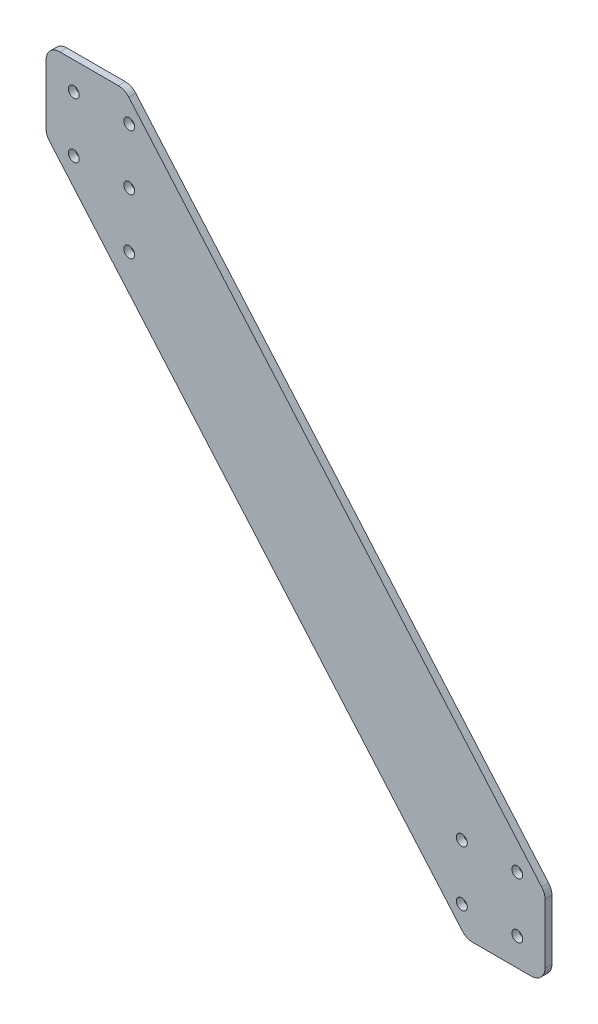
ISO-10303-21;
HEADER;
FILE_DESCRIPTION(('STEP AP214'),'2;1');
FILE_NAME('part.step','',(''),(''),'','','');
FILE_SCHEMA(('AUTOMOTIVE_DESIGN { 1 0 10303 214 1 1 1 1 }'));
ENDSEC;
DATA;
#1=APPLICATION_CONTEXT('core data for automotive mechanical design processes');
#2=APPLICATION_PROTOCOL_DEFINITION('international standard','automotive_design',2000,#1);
#3=PRODUCT_CONTEXT('',#1,'mechanical');
#4=PRODUCT('Part','Part','',(#3));
#5=PRODUCT_RELATED_PRODUCT_CATEGORY('part','',(#4));
#6=PRODUCT_DEFINITION_FORMATION('','',#4);
#7=PRODUCT_DEFINITION_CONTEXT('part definition',#1,'design');
#8=PRODUCT_DEFINITION('design','',#6,#7);
#9=PRODUCT_DEFINITION_SHAPE('','',#8);
#10=(LENGTH_UNIT() NAMED_UNIT(*) SI_UNIT(.MILLI.,.METRE.));
#11=(NAMED_UNIT(*) PLANE_ANGLE_UNIT() SI_UNIT($,.RADIAN.));
#12=(NAMED_UNIT(*) SI_UNIT($,.STERADIAN.) SOLID_ANGLE_UNIT());
#13=UNCERTAINTY_MEASURE_WITH_UNIT(LENGTH_MEASURE(1.E-05),#10,'distance_accuracy_value','');
#14=(GEOMETRIC_REPRESENTATION_CONTEXT(3) GLOBAL_UNCERTAINTY_ASSIGNED_CONTEXT((#13)) GLOBAL_UNIT_ASSIGNED_CONTEXT((#10,
#11,#12)) REPRESENTATION_CONTEXT('',''));
#15=CARTESIAN_POINT('',(0.,0.,0.));
#16=DIRECTION('',(0.,0.,1.));
#17=DIRECTION('',(1.,0.,0.));
#18=AXIS2_PLACEMENT_3D('',#15,#16,#17);
#19=CARTESIAN_POINT('',(0.,0.,3.175));
#20=DIRECTION('',(0.,0.,1.));
#21=DIRECTION('',(1.,0.,0.));
#22=AXIS2_PLACEMENT_3D('',#19,#20,#21);
#23=PLANE('',#22);
#24=CARTESIAN_POINT('',(127.,208.026,3.175));
#25=DIRECTION('',(0.,0.,1.));
#26=DIRECTION('',(1.,0.,0.));
#27=AXIS2_PLACEMENT_3D('',#24,#25,#26);
#28=CIRCLE('',#27,2.48920000000001);
#29=CARTESIAN_POINT('',(129.4892,208.026,3.175));
#30=VERTEX_POINT('',#29);
#31=EDGE_CURVE('E509',#30,#30,#28,.T.);
#32=ORIENTED_EDGE('',*,*,#31,.F.);
#33=EDGE_LOOP('',(#32));
#34=FACE_BOUND('',#33,.T.);
#35=CARTESIAN_POINT('',(101.6,233.426,3.175));
#36=DIRECTION('',(0.,0.,1.));
#37=DIRECTION('',(1.,0.,0.));
#38=AXIS2_PLACEMENT_3D('',#35,#36,#37);
#39=CIRCLE('',#38,2.48920000000002);
#40=CARTESIAN_POINT('',(104.0892,233.426,3.175));
#41=VERTEX_POINT('',#40);
#42=EDGE_CURVE('E497',#41,#41,#39,.T.);
#43=ORIENTED_EDGE('',*,*,#42,.F.);
#44=EDGE_LOOP('',(#43));
#45=FACE_BOUND('',#44,.T.);
#46=CARTESIAN_POINT('',(304.8,25.4635,3.175));
#47=DIRECTION('',(0.,0.,1.));
#48=DIRECTION('',(1.,0.,0.));
#49=AXIS2_PLACEMENT_3D('',#46,#47,#48);
#50=CIRCLE('',#49,2.48920000000001);
#51=CARTESIAN_POINT('',(307.2892,25.4635,3.175));
#52=VERTEX_POINT('',#51);
#53=EDGE_CURVE('E485',#52,#52,#50,.T.);
#54=ORIENTED_EDGE('',*,*,#53,.F.);
#55=EDGE_LOOP('',(#54));
#56=FACE_BOUND('',#55,.T.);
#57=CARTESIAN_POINT('',(304.8,0.0635000000000184,3.175));
#58=DIRECTION('',(0.,0.,1.));
#59=DIRECTION('',(1.,0.,0.));
#60=AXIS2_PLACEMENT_3D('',#57,#58,#59);
#61=CIRCLE('',#60,2.48920000000001);
#62=CARTESIAN_POINT('',(307.2892,0.0635000000000184,3.175));
#63=VERTEX_POINT('',#62);
#64=EDGE_CURVE('E473',#63,#63,#61,.T.);
#65=ORIENTED_EDGE('',*,*,#64,.F.);
#66=EDGE_LOOP('',(#65));
#67=FACE_BOUND('',#66,.T.);
#68=DIRECTION('',(1.,0.,0.));
#69=VECTOR('',#68,1.);
#70=CARTESIAN_POINT('',(281.48437518069,-12.6365,3.175));
#71=LINE('',#70,#69);
#72=CARTESIAN_POINT('',(284.388528283496,-12.6365,3.175));
#73=VERTEX_POINT('',#72);
#74=CARTESIAN_POINT('',(311.15,-12.6365,3.175));
#75=VERTEX_POINT('',#74);
#76=EDGE_CURVE('E169',#73,#75,#71,.T.);
#77=ORIENTED_EDGE('',*,*,#76,.T.);
#78=CARTESIAN_POINT('',(311.15,-6.28649999999999,3.175));
#79=DIRECTION('',(0.,0.,1.));
#80=DIRECTION('',(1.,0.,0.));
#81=AXIS2_PLACEMENT_3D('',#78,#79,#80);
#82=CIRCLE('',#81,6.35);
#83=CARTESIAN_POINT('',(317.5,-6.28649999999999,3.175));
#84=VERTEX_POINT('',#83);
#85=EDGE_CURVE('E201',#75,#84,#82,.T.);
#86=ORIENTED_EDGE('',*,*,#85,.T.);
#87=DIRECTION('',(0.,1.,0.));
#88=VECTOR('',#87,1.);
#89=CARTESIAN_POINT('',(317.5,23.3791248193052,3.175));
#90=LINE('',#89,#88);
#91=CARTESIAN_POINT('',(317.5,21.0146590973637,3.175));
#92=VERTEX_POINT('',#91);
#93=EDGE_CURVE('E151',#84,#92,#90,.T.);
#94=ORIENTED_EDGE('',*,*,#93,.T.);
#95=CARTESIAN_POINT('',(311.15,21.0146590973637,3.175));
#96=DIRECTION('',(0.,0.,1.));
#97=DIRECTION('',(1.,0.,0.));
#98=AXIS2_PLACEMENT_3D('',#95,#96,#97);
#99=CIRCLE('',#98,6.35);
#100=CARTESIAN_POINT('',(315.953563041379,25.167764213719,3.175));
#101=VERTEX_POINT('',#100);
#102=EDGE_CURVE('E194',#92,#101,#99,.T.);
#103=ORIENTED_EDGE('',*,*,#102,.T.);
#104=DIRECTION('',(-0.654032301788227,0.756466620689633,0.));
#105=VECTOR('',#104,1.);
#106=CARTESIAN_POINT('',(124.915624819305,246.126,3.175));
#107=LINE('',#106,#105);
#108=CARTESIAN_POINT('',(126.815034757879,243.929105116355,3.175));
#109=VERTEX_POINT('',#108);
#110=EDGE_CURVE('E223',#101,#109,#107,.T.);
#111=ORIENTED_EDGE('',*,*,#110,.T.);
#112=CARTESIAN_POINT('',(122.011471716499,239.776,3.175));
#113=DIRECTION('',(0.,0.,1.));
#114=DIRECTION('',(1.,0.,0.));
#115=AXIS2_PLACEMENT_3D('',#112,#113,#114);
#116=CIRCLE('',#115,6.35);
#117=CARTESIAN_POINT('',(122.011471716499,246.126,3.175));
#118=VERTEX_POINT('',#117);
#119=EDGE_CURVE('E196',#109,#118,#116,.T.);
#120=ORIENTED_EDGE('',*,*,#119,.T.);
#121=DIRECTION('',(-1.,0.,0.));
#122=VECTOR('',#121,1.);
#123=CARTESIAN_POINT('',(88.9,246.126,3.175));
#124=LINE('',#123,#122);
#125=CARTESIAN_POINT('',(95.25,246.126,3.175));
#126=VERTEX_POINT('',#125);
#127=EDGE_CURVE('E236',#118,#126,#124,.T.);
#128=ORIENTED_EDGE('',*,*,#127,.T.);
#129=CARTESIAN_POINT('',(95.25,239.776,3.175));
#130=DIRECTION('',(0.,0.,1.));
#131=DIRECTION('',(1.,0.,0.));
#132=AXIS2_PLACEMENT_3D('',#129,#130,#131);
#133=CIRCLE('',#132,6.35);
#134=CARTESIAN_POINT('',(88.9,239.776,3.175));
#135=VERTEX_POINT('',#134);
#136=EDGE_CURVE('E192',#126,#135,#133,.T.);
#137=ORIENTED_EDGE('',*,*,#136,.T.);
#138=DIRECTION('',(0.,-1.,0.));
#139=VECTOR('',#138,1.);
#140=CARTESIAN_POINT('',(88.9,246.126,3.175));
#141=LINE('',#140,#139);
#142=CARTESIAN_POINT('',(88.9,212.474840902632,3.175));
#143=VERTEX_POINT('',#142);
#144=EDGE_CURVE('E238',#135,#143,#141,.T.);
#145=ORIENTED_EDGE('',*,*,#144,.T.);
#146=CARTESIAN_POINT('',(95.25,212.474840902632,3.175));
#147=DIRECTION('',(0.,0.,1.));
#148=DIRECTION('',(1.,0.,0.));
#149=AXIS2_PLACEMENT_3D('',#146,#147,#148);
#150=CIRCLE('',#149,6.35);
#151=CARTESIAN_POINT('',(90.4464369586208,208.321735786277,3.175));
#152=VERTEX_POINT('',#151);
#153=EDGE_CURVE('E63',#143,#152,#150,.T.);
#154=ORIENTED_EDGE('',*,*,#153,.T.);
#155=DIRECTION('',(0.654032301788226,-0.756466620689634,0.));
#156=VECTOR('',#155,1.);
#157=CARTESIAN_POINT('',(88.9,210.11037518069,3.175));
#158=LINE('',#157,#156);
#159=CARTESIAN_POINT('',(279.584965242117,-10.4396051163553,3.175));
#160=VERTEX_POINT('',#159);
#161=EDGE_CURVE('E240',#152,#160,#158,.T.);
#162=ORIENTED_EDGE('',*,*,#161,.T.);
#163=CARTESIAN_POINT('',(284.388528283496,-6.2865,3.175));
#164=DIRECTION('',(0.,0.,1.));
#165=DIRECTION('',(1.,0.,0.));
#166=AXIS2_PLACEMENT_3D('',#163,#164,#165);
#167=CIRCLE('',#166,6.35);
#168=EDGE_CURVE('E199',#160,#73,#167,.T.);
#169=ORIENTED_EDGE('',*,*,#168,.T.);
#170=EDGE_LOOP('',(#77,#86,#94,#103,#111,#120,#128,#137,#145,#154,#162,#169));
#171=FACE_BOUND('',#170,.T.);
#172=CARTESIAN_POINT('',(279.4,0.0635000000000149,3.175));
#173=DIRECTION('',(0.,0.,1.));
#174=DIRECTION('',(1.,0.,0.));
#175=AXIS2_PLACEMENT_3D('',#172,#173,#174);
#176=CIRCLE('',#175,2.48920000000001);
#177=CARTESIAN_POINT('',(281.8892,0.0635000000000149,3.175));
#178=VERTEX_POINT('',#177);
#179=EDGE_CURVE('E160',#178,#178,#176,.T.);
#180=ORIENTED_EDGE('',*,*,#179,.F.);
#181=EDGE_LOOP('',(#180));
#182=FACE_BOUND('',#181,.T.);
#183=CARTESIAN_POINT('',(279.4,25.4635,3.175));
#184=DIRECTION('',(0.,0.,1.));
#185=DIRECTION('',(1.,0.,0.));
#186=AXIS2_PLACEMENT_3D('',#183,#184,#185);
#187=CIRCLE('',#186,2.48920000000001);
#188=CARTESIAN_POINT('',(281.8892,25.4635,3.175));
#189=VERTEX_POINT('',#188);
#190=EDGE_CURVE('E480',#189,#189,#187,.T.);
#191=ORIENTED_EDGE('',*,*,#190,.F.);
#192=EDGE_LOOP('',(#191));
#193=FACE_BOUND('',#192,.T.);
#194=CARTESIAN_POINT('',(101.6,208.026,3.175));
#195=DIRECTION('',(0.,0.,1.));
#196=DIRECTION('',(1.,0.,0.));
#197=AXIS2_PLACEMENT_3D('',#194,#195,#196);
#198=CIRCLE('',#197,2.48920000000002);
#199=CARTESIAN_POINT('',(104.0892,208.026,3.175));
#200=VERTEX_POINT('',#199);
#201=EDGE_CURVE('E491',#200,#200,#198,.T.);
#202=ORIENTED_EDGE('',*,*,#201,.F.);
#203=EDGE_LOOP('',(#202));
#204=FACE_BOUND('',#203,.T.);
#205=CARTESIAN_POINT('',(127.,182.626,3.175));
#206=DIRECTION('',(0.,0.,1.));
#207=DIRECTION('',(1.,0.,0.));
#208=AXIS2_PLACEMENT_3D('',#205,#206,#207);
#209=CIRCLE('',#208,2.48920000000001);
#210=CARTESIAN_POINT('',(129.4892,182.626,3.175));
#211=VERTEX_POINT('',#210);
#212=EDGE_CURVE('E503',#211,#211,#209,.T.);
#213=ORIENTED_EDGE('',*,*,#212,.F.);
#214=EDGE_LOOP('',(#213));
#215=FACE_BOUND('',#214,.T.);
#216=CARTESIAN_POINT('',(127.,233.426,3.175));
#217=DIRECTION('',(0.,0.,1.));
#218=DIRECTION('',(1.,0.,0.));
#219=AXIS2_PLACEMENT_3D('',#216,#217,#218);
#220=CIRCLE('',#219,2.48920000000001);
#221=CARTESIAN_POINT('',(129.4892,233.426,3.175));
#222=VERTEX_POINT('',#221);
#223=EDGE_CURVE('E515',#222,#222,#220,.T.);
#224=ORIENTED_EDGE('',*,*,#223,.F.);
#225=EDGE_LOOP('',(#224));
#226=FACE_BOUND('',#225,.T.);
#227=ADVANCED_FACE('F41',(#34,#45,#56,#67,#171,#182,#193,#204,#215,#226),#23,.T.);
#228=CARTESIAN_POINT('',(0.,0.,0.));
#229=DIRECTION('',(0.,0.,1.));
#230=DIRECTION('',(1.,0.,0.));
#231=AXIS2_PLACEMENT_3D('',#228,#229,#230);
#232=PLANE('',#231);
#233=DIRECTION('',(0.,1.,0.));
#234=VECTOR('',#233,1.);
#235=CARTESIAN_POINT('',(317.5,23.3791248193052,0.));
#236=LINE('',#235,#234);
#237=CARTESIAN_POINT('',(317.5,-6.28649999999999,0.));
#238=VERTEX_POINT('',#237);
#239=CARTESIAN_POINT('',(317.5,21.0146590973637,0.));
#240=VERTEX_POINT('',#239);
#241=EDGE_CURVE('E148',#238,#240,#236,.T.);
#242=ORIENTED_EDGE('',*,*,#241,.F.);
#243=CARTESIAN_POINT('',(311.15,-6.28649999999999,0.));
#244=DIRECTION('',(0.,0.,1.));
#245=DIRECTION('',(1.,0.,0.));
#246=AXIS2_PLACEMENT_3D('',#243,#244,#245);
#247=CIRCLE('',#246,6.35);
#248=CARTESIAN_POINT('',(311.15,-12.6365,0.));
#249=VERTEX_POINT('',#248);
#250=EDGE_CURVE('E131',#238,#249,#247,.F.);
#251=ORIENTED_EDGE('',*,*,#250,.T.);
#252=DIRECTION('',(1.,0.,0.));
#253=VECTOR('',#252,1.);
#254=CARTESIAN_POINT('',(281.48437518069,-12.6365,0.));
#255=LINE('',#254,#253);
#256=CARTESIAN_POINT('',(284.388528283496,-12.6365,0.));
#257=VERTEX_POINT('',#256);
#258=EDGE_CURVE('E179',#257,#249,#255,.T.);
#259=ORIENTED_EDGE('',*,*,#258,.F.);
#260=CARTESIAN_POINT('',(284.388528283496,-6.2865,0.));
#261=DIRECTION('',(0.,0.,1.));
#262=DIRECTION('',(1.,0.,0.));
#263=AXIS2_PLACEMENT_3D('',#260,#261,#262);
#264=CIRCLE('',#263,6.35);
#265=CARTESIAN_POINT('',(279.584965242117,-10.4396051163553,0.));
#266=VERTEX_POINT('',#265);
#267=EDGE_CURVE('E142',#257,#266,#264,.F.);
#268=ORIENTED_EDGE('',*,*,#267,.T.);
#269=DIRECTION('',(0.654032301788226,-0.756466620689634,0.));
#270=VECTOR('',#269,1.);
#271=CARTESIAN_POINT('',(88.9,210.11037518069,0.));
#272=LINE('',#271,#270);
#273=CARTESIAN_POINT('',(90.4464369586208,208.321735786277,0.));
#274=VERTEX_POINT('',#273);
#275=EDGE_CURVE('E177',#274,#266,#272,.T.);
#276=ORIENTED_EDGE('',*,*,#275,.F.);
#277=CARTESIAN_POINT('',(95.25,212.474840902632,0.));
#278=DIRECTION('',(0.,0.,1.));
#279=DIRECTION('',(1.,0.,0.));
#280=AXIS2_PLACEMENT_3D('',#277,#278,#279);
#281=CIRCLE('',#280,6.35);
#282=CARTESIAN_POINT('',(88.9,212.474840902632,0.));
#283=VERTEX_POINT('',#282);
#284=EDGE_CURVE('E186',#274,#283,#281,.F.);
#285=ORIENTED_EDGE('',*,*,#284,.T.);
#286=DIRECTION('',(0.,-1.,0.));
#287=VECTOR('',#286,1.);
#288=CARTESIAN_POINT('',(88.9,246.126,0.));
#289=LINE('',#288,#287);
#290=CARTESIAN_POINT('',(88.9,239.776,0.));
#291=VERTEX_POINT('',#290);
#292=EDGE_CURVE('E174',#291,#283,#289,.T.);
#293=ORIENTED_EDGE('',*,*,#292,.F.);
#294=CARTESIAN_POINT('',(95.25,239.776,0.));
#295=DIRECTION('',(0.,0.,1.));
#296=DIRECTION('',(1.,0.,0.));
#297=AXIS2_PLACEMENT_3D('',#294,#295,#296);
#298=CIRCLE('',#297,6.35);
#299=CARTESIAN_POINT('',(95.25,246.126,0.));
#300=VERTEX_POINT('',#299);
#301=EDGE_CURVE('E152',#291,#300,#298,.F.);
#302=ORIENTED_EDGE('',*,*,#301,.T.);
#303=DIRECTION('',(-1.,0.,0.));
#304=VECTOR('',#303,1.);
#305=CARTESIAN_POINT('',(88.9,246.126,0.));
#306=LINE('',#305,#304);
#307=CARTESIAN_POINT('',(122.011471716499,246.126,0.));
#308=VERTEX_POINT('',#307);
#309=EDGE_CURVE('E163',#308,#300,#306,.T.);
#310=ORIENTED_EDGE('',*,*,#309,.F.);
#311=CARTESIAN_POINT('',(122.011471716499,239.776,0.));
#312=DIRECTION('',(0.,0.,1.));
#313=DIRECTION('',(1.,0.,0.));
#314=AXIS2_PLACEMENT_3D('',#311,#312,#313);
#315=CIRCLE('',#314,6.35);
#316=CARTESIAN_POINT('',(126.815034757879,243.929105116355,0.));
#317=VERTEX_POINT('',#316);
#318=EDGE_CURVE('E184',#308,#317,#315,.F.);
#319=ORIENTED_EDGE('',*,*,#318,.T.);
#320=DIRECTION('',(-0.654032301788227,0.756466620689633,0.));
#321=VECTOR('',#320,1.);
#322=CARTESIAN_POINT('',(124.915624819305,246.126,0.));
#323=LINE('',#322,#321);
#324=CARTESIAN_POINT('',(315.953563041379,25.167764213719,0.));
#325=VERTEX_POINT('',#324);
#326=EDGE_CURVE('E159',#325,#317,#323,.T.);
#327=ORIENTED_EDGE('',*,*,#326,.F.);
#328=CARTESIAN_POINT('',(311.15,21.0146590973637,0.));
#329=DIRECTION('',(0.,0.,1.));
#330=DIRECTION('',(1.,0.,0.));
#331=AXIS2_PLACEMENT_3D('',#328,#329,#330);
#332=CIRCLE('',#331,6.35);
#333=EDGE_CURVE('E158',#325,#240,#332,.F.);
#334=ORIENTED_EDGE('',*,*,#333,.T.);
#335=EDGE_LOOP('',(#242,#251,#259,#268,#276,#285,#293,#302,#310,#319,#327,#334));
#336=FACE_BOUND('',#335,.T.);
#337=CARTESIAN_POINT('',(279.4,0.0635000000000149,0.));
#338=DIRECTION('',(0.,0.,1.));
#339=DIRECTION('',(1.,0.,0.));
#340=AXIS2_PLACEMENT_3D('',#337,#338,#339);
#341=CIRCLE('',#340,2.48920000000001);
#342=CARTESIAN_POINT('',(281.8892,0.0635000000000149,0.));
#343=VERTEX_POINT('',#342);
#344=EDGE_CURVE('E166',#343,#343,#341,.T.);
#345=ORIENTED_EDGE('',*,*,#344,.T.);
#346=EDGE_LOOP('',(#345));
#347=FACE_BOUND('',#346,.T.);
#348=CARTESIAN_POINT('',(304.8,0.0635000000000184,0.));
#349=DIRECTION('',(0.,0.,1.));
#350=DIRECTION('',(1.,0.,0.));
#351=AXIS2_PLACEMENT_3D('',#348,#349,#350);
#352=CIRCLE('',#351,2.48920000000001);
#353=CARTESIAN_POINT('',(307.2892,0.0635000000000184,0.));
#354=VERTEX_POINT('',#353);
#355=EDGE_CURVE('E476',#354,#354,#352,.T.);
#356=ORIENTED_EDGE('',*,*,#355,.T.);
#357=EDGE_LOOP('',(#356));
#358=FACE_BOUND('',#357,.T.);
#359=CARTESIAN_POINT('',(279.4,25.4635,0.));
#360=DIRECTION('',(0.,0.,1.));
#361=DIRECTION('',(1.,0.,0.));
#362=AXIS2_PLACEMENT_3D('',#359,#360,#361);
#363=CIRCLE('',#362,2.48920000000001);
#364=CARTESIAN_POINT('',(281.8892,25.4635,0.));
#365=VERTEX_POINT('',#364);
#366=EDGE_CURVE('E482',#365,#365,#363,.T.);
#367=ORIENTED_EDGE('',*,*,#366,.T.);
#368=EDGE_LOOP('',(#367));
#369=FACE_BOUND('',#368,.T.);
#370=CARTESIAN_POINT('',(304.8,25.4635,0.));
#371=DIRECTION('',(0.,0.,1.));
#372=DIRECTION('',(1.,0.,0.));
#373=AXIS2_PLACEMENT_3D('',#370,#371,#372);
#374=CIRCLE('',#373,2.48920000000001);
#375=CARTESIAN_POINT('',(307.2892,25.4635,0.));
#376=VERTEX_POINT('',#375);
#377=EDGE_CURVE('E488',#376,#376,#374,.T.);
#378=ORIENTED_EDGE('',*,*,#377,.T.);
#379=EDGE_LOOP('',(#378));
#380=FACE_BOUND('',#379,.T.);
#381=CARTESIAN_POINT('',(101.6,208.026,0.));
#382=DIRECTION('',(0.,0.,1.));
#383=DIRECTION('',(1.,0.,0.));
#384=AXIS2_PLACEMENT_3D('',#381,#382,#383);
#385=CIRCLE('',#384,2.48920000000002);
#386=CARTESIAN_POINT('',(104.0892,208.026,0.));
#387=VERTEX_POINT('',#386);
#388=EDGE_CURVE('E494',#387,#387,#385,.T.);
#389=ORIENTED_EDGE('',*,*,#388,.T.);
#390=EDGE_LOOP('',(#389));
#391=FACE_BOUND('',#390,.T.);
#392=CARTESIAN_POINT('',(101.6,233.426,0.));
#393=DIRECTION('',(0.,0.,1.));
#394=DIRECTION('',(1.,0.,0.));
#395=AXIS2_PLACEMENT_3D('',#392,#393,#394);
#396=CIRCLE('',#395,2.48920000000002);
#397=CARTESIAN_POINT('',(104.0892,233.426,0.));
#398=VERTEX_POINT('',#397);
#399=EDGE_CURVE('E500',#398,#398,#396,.T.);
#400=ORIENTED_EDGE('',*,*,#399,.T.);
#401=EDGE_LOOP('',(#400));
#402=FACE_BOUND('',#401,.T.);
#403=CARTESIAN_POINT('',(127.,182.626,0.));
#404=DIRECTION('',(0.,0.,1.));
#405=DIRECTION('',(1.,0.,0.));
#406=AXIS2_PLACEMENT_3D('',#403,#404,#405);
#407=CIRCLE('',#406,2.48920000000001);
#408=CARTESIAN_POINT('',(129.4892,182.626,0.));
#409=VERTEX_POINT('',#408);
#410=EDGE_CURVE('E506',#409,#409,#407,.T.);
#411=ORIENTED_EDGE('',*,*,#410,.T.);
#412=EDGE_LOOP('',(#411));
#413=FACE_BOUND('',#412,.T.);
#414=CARTESIAN_POINT('',(127.,208.026,0.));
#415=DIRECTION('',(0.,0.,1.));
#416=DIRECTION('',(1.,0.,0.));
#417=AXIS2_PLACEMENT_3D('',#414,#415,#416);
#418=CIRCLE('',#417,2.48920000000001);
#419=CARTESIAN_POINT('',(129.4892,208.026,0.));
#420=VERTEX_POINT('',#419);
#421=EDGE_CURVE('E512',#420,#420,#418,.T.);
#422=ORIENTED_EDGE('',*,*,#421,.T.);
#423=EDGE_LOOP('',(#422));
#424=FACE_BOUND('',#423,.T.);
#425=CARTESIAN_POINT('',(127.,233.426,0.));
#426=DIRECTION('',(0.,0.,1.));
#427=DIRECTION('',(1.,0.,0.));
#428=AXIS2_PLACEMENT_3D('',#425,#426,#427);
#429=CIRCLE('',#428,2.48920000000001);
#430=CARTESIAN_POINT('',(129.4892,233.426,0.));
#431=VERTEX_POINT('',#430);
#432=EDGE_CURVE('E518',#431,#431,#429,.T.);
#433=ORIENTED_EDGE('',*,*,#432,.T.);
#434=EDGE_LOOP('',(#433));
#435=FACE_BOUND('',#434,.T.);
#436=ADVANCED_FACE('F155',(#336,#347,#358,#369,#380,#391,#402,#413,#424,#435),#232,.F.);
#437=CARTESIAN_POINT('',(317.5,23.3791248193052,3.175));
#438=DIRECTION('',(-1.,0.,0.));
#439=DIRECTION('',(0.,0.,1.));
#440=AXIS2_PLACEMENT_3D('',#437,#438,#439);
#441=PLANE('',#440);
#442=ORIENTED_EDGE('',*,*,#93,.F.);
#443=DIRECTION('',(0.,0.,-1.));
#444=VECTOR('',#443,1.);
#445=CARTESIAN_POINT('',(317.5,-6.28649999999999,3.175));
#446=LINE('',#445,#444);
#447=EDGE_CURVE('E135',#84,#238,#446,.T.);
#448=ORIENTED_EDGE('',*,*,#447,.T.);
#449=ORIENTED_EDGE('',*,*,#241,.T.);
#450=DIRECTION('',(0.,0.,-1.));
#451=VECTOR('',#450,1.);
#452=CARTESIAN_POINT('',(317.5,21.0146590973637,3.175));
#453=LINE('',#452,#451);
#454=EDGE_CURVE('E153',#240,#92,#453,.F.);
#455=ORIENTED_EDGE('',*,*,#454,.T.);
#456=EDGE_LOOP('',(#442,#448,#449,#455));
#457=FACE_BOUND('',#456,.T.);
#458=ADVANCED_FACE('F147',(#457),#441,.F.);
#459=CARTESIAN_POINT('',(124.915624819305,246.126,3.175));
#460=DIRECTION('',(-0.756466620689633,-0.654032301788227,0.));
#461=DIRECTION('',(0.654032301788227,-0.756466620689633,0.));
#462=AXIS2_PLACEMENT_3D('',#459,#460,#461);
#463=PLANE('',#462);
#464=ORIENTED_EDGE('',*,*,#326,.T.);
#465=DIRECTION('',(0.,0.,-1.));
#466=VECTOR('',#465,1.);
#467=CARTESIAN_POINT('',(126.815034757879,243.929105116355,3.175));
#468=LINE('',#467,#466);
#469=EDGE_CURVE('E11',#317,#109,#468,.F.);
#470=ORIENTED_EDGE('',*,*,#469,.T.);
#471=ORIENTED_EDGE('',*,*,#110,.F.);
#472=DIRECTION('',(0.,0.,-1.));
#473=VECTOR('',#472,1.);
#474=CARTESIAN_POINT('',(315.953563041379,25.1677642137189,3.175));
#475=LINE('',#474,#473);
#476=EDGE_CURVE('E49',#101,#325,#475,.T.);
#477=ORIENTED_EDGE('',*,*,#476,.T.);
#478=EDGE_LOOP('',(#464,#470,#471,#477));
#479=FACE_BOUND('',#478,.T.);
#480=ADVANCED_FACE('F220',(#479),#463,.F.);
#481=CARTESIAN_POINT('',(88.9,246.126,3.175));
#482=DIRECTION('',(0.,-1.,0.));
#483=DIRECTION('',(0.,0.,-1.));
#484=AXIS2_PLACEMENT_3D('',#481,#482,#483);
#485=PLANE('',#484);
#486=ORIENTED_EDGE('',*,*,#127,.F.);
#487=DIRECTION('',(0.,0.,-1.));
#488=VECTOR('',#487,1.);
#489=CARTESIAN_POINT('',(122.011471716499,246.126,3.175));
#490=LINE('',#489,#488);
#491=EDGE_CURVE('E214',#118,#308,#490,.T.);
#492=ORIENTED_EDGE('',*,*,#491,.T.);
#493=ORIENTED_EDGE('',*,*,#309,.T.);
#494=DIRECTION('',(0.,0.,-1.));
#495=VECTOR('',#494,1.);
#496=CARTESIAN_POINT('',(95.25,246.126,3.175));
#497=LINE('',#496,#495);
#498=EDGE_CURVE('E212',#300,#126,#497,.F.);
#499=ORIENTED_EDGE('',*,*,#498,.T.);
#500=EDGE_LOOP('',(#486,#492,#493,#499));
#501=FACE_BOUND('',#500,.T.);
#502=ADVANCED_FACE('F233',(#501),#485,.F.);
#503=CARTESIAN_POINT('',(88.9,246.126,3.175));
#504=DIRECTION('',(1.,0.,0.));
#505=DIRECTION('',(0.,0.,-1.));
#506=AXIS2_PLACEMENT_3D('',#503,#504,#505);
#507=PLANE('',#506);
#508=ORIENTED_EDGE('',*,*,#292,.T.);
#509=DIRECTION('',(0.,0.,-1.));
#510=VECTOR('',#509,1.);
#511=CARTESIAN_POINT('',(88.9,212.474840902632,3.175));
#512=LINE('',#511,#510);
#513=EDGE_CURVE('E210',#283,#143,#512,.F.);
#514=ORIENTED_EDGE('',*,*,#513,.T.);
#515=ORIENTED_EDGE('',*,*,#144,.F.);
#516=DIRECTION('',(0.,0.,-1.));
#517=VECTOR('',#516,1.);
#518=CARTESIAN_POINT('',(88.9,239.776,3.175));
#519=LINE('',#518,#517);
#520=EDGE_CURVE('E207',#135,#291,#519,.T.);
#521=ORIENTED_EDGE('',*,*,#520,.T.);
#522=EDGE_LOOP('',(#508,#514,#515,#521));
#523=FACE_BOUND('',#522,.T.);
#524=ADVANCED_FACE('F261',(#523),#507,.F.);
#525=CARTESIAN_POINT('',(88.9,210.11037518069,3.175));
#526=DIRECTION('',(0.756466620689634,0.654032301788226,0.));
#527=DIRECTION('',(-0.654032301788226,0.756466620689634,0.));
#528=AXIS2_PLACEMENT_3D('',#525,#526,#527);
#529=PLANE('',#528);
#530=ORIENTED_EDGE('',*,*,#275,.T.);
#531=DIRECTION('',(0.,0.,-1.));
#532=VECTOR('',#531,1.);
#533=CARTESIAN_POINT('',(279.584965242117,-10.4396051163552,3.175));
#534=LINE('',#533,#532);
#535=EDGE_CURVE('E56',#266,#160,#534,.F.);
#536=ORIENTED_EDGE('',*,*,#535,.T.);
#537=ORIENTED_EDGE('',*,*,#161,.F.);
#538=DIRECTION('',(0.,0.,-1.));
#539=VECTOR('',#538,1.);
#540=CARTESIAN_POINT('',(90.4464369586208,208.321735786277,3.175));
#541=LINE('',#540,#539);
#542=EDGE_CURVE('E203',#152,#274,#541,.T.);
#543=ORIENTED_EDGE('',*,*,#542,.T.);
#544=EDGE_LOOP('',(#530,#536,#537,#543));
#545=FACE_BOUND('',#544,.T.);
#546=ADVANCED_FACE('F254',(#545),#529,.F.);
#547=CARTESIAN_POINT('',(281.48437518069,-12.6365,3.175));
#548=DIRECTION('',(0.,1.,0.));
#549=DIRECTION('',(-1.,0.,0.));
#550=AXIS2_PLACEMENT_3D('',#547,#548,#549);
#551=PLANE('',#550);
#552=ORIENTED_EDGE('',*,*,#258,.T.);
#553=DIRECTION('',(0.,0.,-1.));
#554=VECTOR('',#553,1.);
#555=CARTESIAN_POINT('',(311.15,-12.6365,3.175));
#556=LINE('',#555,#554);
#557=EDGE_CURVE('E136',#249,#75,#556,.F.);
#558=ORIENTED_EDGE('',*,*,#557,.T.);
#559=ORIENTED_EDGE('',*,*,#76,.F.);
#560=DIRECTION('',(0.,0.,-1.));
#561=VECTOR('',#560,1.);
#562=CARTESIAN_POINT('',(284.388528283496,-12.6365,3.175));
#563=LINE('',#562,#561);
#564=EDGE_CURVE('E141',#73,#257,#563,.T.);
#565=ORIENTED_EDGE('',*,*,#564,.T.);
#566=EDGE_LOOP('',(#552,#558,#559,#565));
#567=FACE_BOUND('',#566,.T.);
#568=ADVANCED_FACE('F250',(#567),#551,.F.);
#569=CARTESIAN_POINT('',(279.4,0.0635000000000149,3.175));
#570=DIRECTION('',(0.,0.,-1.));
#571=DIRECTION('',(-1.,0.,0.));
#572=AXIS2_PLACEMENT_3D('',#569,#570,#571);
#573=CYLINDRICAL_SURFACE('',#572,2.48920000000001);
#574=ORIENTED_EDGE('',*,*,#179,.T.);
#575=EDGE_LOOP('',(#574));
#576=FACE_BOUND('',#575,.T.);
#577=ORIENTED_EDGE('',*,*,#344,.F.);
#578=EDGE_LOOP('',(#577));
#579=FACE_BOUND('',#578,.T.);
#580=ADVANCED_FACE('F281',(#576,#579),#573,.F.);
#581=CARTESIAN_POINT('',(304.8,0.0635000000000184,3.175));
#582=DIRECTION('',(0.,0.,-1.));
#583=DIRECTION('',(-1.,0.,0.));
#584=AXIS2_PLACEMENT_3D('',#581,#582,#583);
#585=CYLINDRICAL_SURFACE('',#584,2.48920000000001);
#586=ORIENTED_EDGE('',*,*,#64,.T.);
#587=EDGE_LOOP('',(#586));
#588=FACE_BOUND('',#587,.T.);
#589=ORIENTED_EDGE('',*,*,#355,.F.);
#590=EDGE_LOOP('',(#589));
#591=FACE_BOUND('',#590,.T.);
#592=ADVANCED_FACE('F394',(#588,#591),#585,.F.);
#593=CARTESIAN_POINT('',(279.4,25.4635,3.175));
#594=DIRECTION('',(0.,0.,-1.));
#595=DIRECTION('',(-1.,0.,0.));
#596=AXIS2_PLACEMENT_3D('',#593,#594,#595);
#597=CYLINDRICAL_SURFACE('',#596,2.48920000000001);
#598=ORIENTED_EDGE('',*,*,#190,.T.);
#599=EDGE_LOOP('',(#598));
#600=FACE_BOUND('',#599,.T.);
#601=ORIENTED_EDGE('',*,*,#366,.F.);
#602=EDGE_LOOP('',(#601));
#603=FACE_BOUND('',#602,.T.);
#604=ADVANCED_FACE('F385',(#600,#603),#597,.F.);
#605=CARTESIAN_POINT('',(304.8,25.4635,3.175));
#606=DIRECTION('',(0.,0.,-1.));
#607=DIRECTION('',(-1.,0.,0.));
#608=AXIS2_PLACEMENT_3D('',#605,#606,#607);
#609=CYLINDRICAL_SURFACE('',#608,2.48920000000001);
#610=ORIENTED_EDGE('',*,*,#53,.T.);
#611=EDGE_LOOP('',(#610));
#612=FACE_BOUND('',#611,.T.);
#613=ORIENTED_EDGE('',*,*,#377,.F.);
#614=EDGE_LOOP('',(#613));
#615=FACE_BOUND('',#614,.T.);
#616=ADVANCED_FACE('F376',(#612,#615),#609,.F.);
#617=CARTESIAN_POINT('',(101.6,208.026,3.175));
#618=DIRECTION('',(0.,0.,-1.));
#619=DIRECTION('',(-1.,0.,0.));
#620=AXIS2_PLACEMENT_3D('',#617,#618,#619);
#621=CYLINDRICAL_SURFACE('',#620,2.48920000000002);
#622=ORIENTED_EDGE('',*,*,#201,.T.);
#623=EDGE_LOOP('',(#622));
#624=FACE_BOUND('',#623,.T.);
#625=ORIENTED_EDGE('',*,*,#388,.F.);
#626=EDGE_LOOP('',(#625));
#627=FACE_BOUND('',#626,.T.);
#628=ADVANCED_FACE('F367',(#624,#627),#621,.F.);
#629=CARTESIAN_POINT('',(101.6,233.426,3.175));
#630=DIRECTION('',(0.,0.,-1.));
#631=DIRECTION('',(-1.,0.,0.));
#632=AXIS2_PLACEMENT_3D('',#629,#630,#631);
#633=CYLINDRICAL_SURFACE('',#632,2.48920000000002);
#634=ORIENTED_EDGE('',*,*,#42,.T.);
#635=EDGE_LOOP('',(#634));
#636=FACE_BOUND('',#635,.T.);
#637=ORIENTED_EDGE('',*,*,#399,.F.);
#638=EDGE_LOOP('',(#637));
#639=FACE_BOUND('',#638,.T.);
#640=ADVANCED_FACE('F358',(#636,#639),#633,.F.);
#641=CARTESIAN_POINT('',(127.,182.626,3.175));
#642=DIRECTION('',(0.,0.,-1.));
#643=DIRECTION('',(-1.,0.,0.));
#644=AXIS2_PLACEMENT_3D('',#641,#642,#643);
#645=CYLINDRICAL_SURFACE('',#644,2.48920000000001);
#646=ORIENTED_EDGE('',*,*,#212,.T.);
#647=EDGE_LOOP('',(#646));
#648=FACE_BOUND('',#647,.T.);
#649=ORIENTED_EDGE('',*,*,#410,.F.);
#650=EDGE_LOOP('',(#649));
#651=FACE_BOUND('',#650,.T.);
#652=ADVANCED_FACE('F349',(#648,#651),#645,.F.);
#653=CARTESIAN_POINT('',(127.,208.026,3.175));
#654=DIRECTION('',(0.,0.,-1.));
#655=DIRECTION('',(-1.,0.,0.));
#656=AXIS2_PLACEMENT_3D('',#653,#654,#655);
#657=CYLINDRICAL_SURFACE('',#656,2.48920000000001);
#658=ORIENTED_EDGE('',*,*,#31,.T.);
#659=EDGE_LOOP('',(#658));
#660=FACE_BOUND('',#659,.T.);
#661=ORIENTED_EDGE('',*,*,#421,.F.);
#662=EDGE_LOOP('',(#661));
#663=FACE_BOUND('',#662,.T.);
#664=ADVANCED_FACE('F340',(#660,#663),#657,.F.);
#665=CARTESIAN_POINT('',(127.,233.426,3.175));
#666=DIRECTION('',(0.,0.,-1.));
#667=DIRECTION('',(-1.,0.,0.));
#668=AXIS2_PLACEMENT_3D('',#665,#666,#667);
#669=CYLINDRICAL_SURFACE('',#668,2.48920000000001);
#670=ORIENTED_EDGE('',*,*,#223,.T.);
#671=EDGE_LOOP('',(#670));
#672=FACE_BOUND('',#671,.T.);
#673=ORIENTED_EDGE('',*,*,#432,.F.);
#674=EDGE_LOOP('',(#673));
#675=FACE_BOUND('',#674,.T.);
#676=ADVANCED_FACE('F298',(#672,#675),#669,.F.);
#677=CARTESIAN_POINT('',(311.15,-6.28649999999999,3.175));
#678=DIRECTION('',(0.,0.,-1.));
#679=DIRECTION('',(-1.,0.,0.));
#680=AXIS2_PLACEMENT_3D('',#677,#678,#679);
#681=CYLINDRICAL_SURFACE('',#680,6.35);
#682=ORIENTED_EDGE('',*,*,#85,.F.);
#683=ORIENTED_EDGE('',*,*,#557,.F.);
#684=ORIENTED_EDGE('',*,*,#250,.F.);
#685=ORIENTED_EDGE('',*,*,#447,.F.);
#686=EDGE_LOOP('',(#682,#683,#684,#685));
#687=FACE_BOUND('',#686,.T.);
#688=ADVANCED_FACE('F134',(#687),#681,.T.);
#689=CARTESIAN_POINT('',(284.388528283496,-6.2865,3.175));
#690=DIRECTION('',(0.,0.,-1.));
#691=DIRECTION('',(-1.,0.,0.));
#692=AXIS2_PLACEMENT_3D('',#689,#690,#691);
#693=CYLINDRICAL_SURFACE('',#692,6.35);
#694=ORIENTED_EDGE('',*,*,#168,.F.);
#695=ORIENTED_EDGE('',*,*,#535,.F.);
#696=ORIENTED_EDGE('',*,*,#267,.F.);
#697=ORIENTED_EDGE('',*,*,#564,.F.);
#698=EDGE_LOOP('',(#694,#695,#696,#697));
#699=FACE_BOUND('',#698,.T.);
#700=ADVANCED_FACE('F252',(#699),#693,.T.);
#701=CARTESIAN_POINT('',(95.25,212.474840902632,3.175));
#702=DIRECTION('',(0.,0.,-1.));
#703=DIRECTION('',(-1.,0.,0.));
#704=AXIS2_PLACEMENT_3D('',#701,#702,#703);
#705=CYLINDRICAL_SURFACE('',#704,6.35);
#706=ORIENTED_EDGE('',*,*,#153,.F.);
#707=ORIENTED_EDGE('',*,*,#513,.F.);
#708=ORIENTED_EDGE('',*,*,#284,.F.);
#709=ORIENTED_EDGE('',*,*,#542,.F.);
#710=EDGE_LOOP('',(#706,#707,#708,#709));
#711=FACE_BOUND('',#710,.T.);
#712=ADVANCED_FACE('F257',(#711),#705,.T.);
#713=CARTESIAN_POINT('',(122.011471716499,239.776,3.175));
#714=DIRECTION('',(0.,0.,-1.));
#715=DIRECTION('',(-1.,0.,0.));
#716=AXIS2_PLACEMENT_3D('',#713,#714,#715);
#717=CYLINDRICAL_SURFACE('',#716,6.35);
#718=ORIENTED_EDGE('',*,*,#119,.F.);
#719=ORIENTED_EDGE('',*,*,#469,.F.);
#720=ORIENTED_EDGE('',*,*,#318,.F.);
#721=ORIENTED_EDGE('',*,*,#491,.F.);
#722=EDGE_LOOP('',(#718,#719,#720,#721));
#723=FACE_BOUND('',#722,.T.);
#724=ADVANCED_FACE('F230',(#723),#717,.T.);
#725=CARTESIAN_POINT('',(311.15,21.0146590973637,3.175));
#726=DIRECTION('',(0.,0.,-1.));
#727=DIRECTION('',(-1.,0.,0.));
#728=AXIS2_PLACEMENT_3D('',#725,#726,#727);
#729=CYLINDRICAL_SURFACE('',#728,6.35);
#730=ORIENTED_EDGE('',*,*,#102,.F.);
#731=ORIENTED_EDGE('',*,*,#454,.F.);
#732=ORIENTED_EDGE('',*,*,#333,.F.);
#733=ORIENTED_EDGE('',*,*,#476,.F.);
#734=EDGE_LOOP('',(#730,#731,#732,#733));
#735=FACE_BOUND('',#734,.T.);
#736=ADVANCED_FACE('F266',(#735),#729,.T.);
#737=CARTESIAN_POINT('',(95.25,239.776,3.175));
#738=DIRECTION('',(0.,0.,-1.));
#739=DIRECTION('',(-1.,0.,0.));
#740=AXIS2_PLACEMENT_3D('',#737,#738,#739);
#741=CYLINDRICAL_SURFACE('',#740,6.35);
#742=ORIENTED_EDGE('',*,*,#136,.F.);
#743=ORIENTED_EDGE('',*,*,#498,.F.);
#744=ORIENTED_EDGE('',*,*,#301,.F.);
#745=ORIENTED_EDGE('',*,*,#520,.F.);
#746=EDGE_LOOP('',(#742,#743,#744,#745));
#747=FACE_BOUND('',#746,.T.);
#748=ADVANCED_FACE('F43',(#747),#741,.T.);
#749=CLOSED_SHELL('',(#227,#436,#458,#480,#502,#524,#546,#568,#580,#592,#604,#616,#628,#640,
#652,#664,#676,#688,#700,#712,#724,#736,#748));
#750=MANIFOLD_SOLID_BREP('B2',#749);
#751=ADVANCED_BREP_SHAPE_REPRESENTATION('',(#18,#750),#14);
#752=SHAPE_DEFINITION_REPRESENTATION(#9,#751);
ENDSEC;
END-ISO-10303-21;
